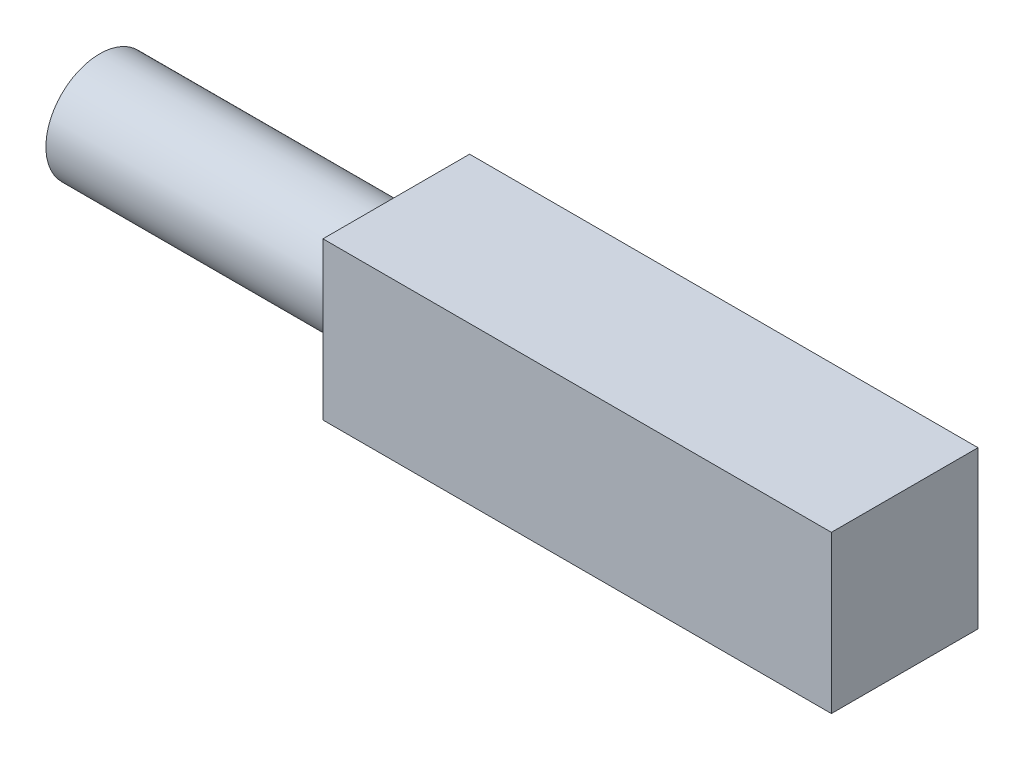
ISO-10303-21;
HEADER;
FILE_DESCRIPTION(('STEP AP214'),'2;1');
FILE_NAME('part.step','',(''),(''),'','','');
FILE_SCHEMA(('AUTOMOTIVE_DESIGN { 1 0 10303 214 1 1 1 1 }'));
ENDSEC;
DATA;
#1=APPLICATION_CONTEXT('core data for automotive mechanical design processes');
#2=APPLICATION_PROTOCOL_DEFINITION('international standard','automotive_design',2000,#1);
#3=PRODUCT_CONTEXT('',#1,'mechanical');
#4=PRODUCT('Part','Part','',(#3));
#5=PRODUCT_RELATED_PRODUCT_CATEGORY('part','',(#4));
#6=PRODUCT_DEFINITION_FORMATION('','',#4);
#7=PRODUCT_DEFINITION_CONTEXT('part definition',#1,'design');
#8=PRODUCT_DEFINITION('design','',#6,#7);
#9=PRODUCT_DEFINITION_SHAPE('','',#8);
#10=(LENGTH_UNIT() NAMED_UNIT(*) SI_UNIT(.MILLI.,.METRE.));
#11=(NAMED_UNIT(*) PLANE_ANGLE_UNIT() SI_UNIT($,.RADIAN.));
#12=(NAMED_UNIT(*) SI_UNIT($,.STERADIAN.) SOLID_ANGLE_UNIT());
#13=UNCERTAINTY_MEASURE_WITH_UNIT(LENGTH_MEASURE(1.E-05),#10,'distance_accuracy_value','');
#14=(GEOMETRIC_REPRESENTATION_CONTEXT(3) GLOBAL_UNCERTAINTY_ASSIGNED_CONTEXT((#13)) GLOBAL_UNIT_ASSIGNED_CONTEXT((#10,
#11,#12)) REPRESENTATION_CONTEXT('',''));
#15=CARTESIAN_POINT('',(0.,0.,0.));
#16=DIRECTION('',(0.,0.,1.));
#17=DIRECTION('',(1.,0.,0.));
#18=AXIS2_PLACEMENT_3D('',#15,#16,#17);
#19=CARTESIAN_POINT('',(70.,0.,0.));
#20=DIRECTION('',(-1.,0.,0.));
#21=DIRECTION('',(0.,0.,1.));
#22=AXIS2_PLACEMENT_3D('',#19,#20,#21);
#23=CYLINDRICAL_SURFACE('',#22,12.7);
#24=CARTESIAN_POINT('',(70.,0.,0.));
#25=DIRECTION('',(1.,0.,0.));
#26=DIRECTION('',(0.,0.,-1.));
#27=AXIS2_PLACEMENT_3D('',#24,#25,#26);
#28=CIRCLE('',#27,12.7);
#29=CARTESIAN_POINT('',(70.,0.,-12.7));
#30=VERTEX_POINT('',#29);
#31=EDGE_CURVE('E11',#30,#30,#28,.T.);
#32=ORIENTED_EDGE('',*,*,#31,.F.);
#33=EDGE_LOOP('',(#32));
#34=FACE_BOUND('',#33,.T.);
#35=CARTESIAN_POINT('',(0.,0.,0.));
#36=DIRECTION('',(1.,0.,0.));
#37=DIRECTION('',(0.,0.,-1.));
#38=AXIS2_PLACEMENT_3D('',#35,#36,#37);
#39=CIRCLE('',#38,12.7);
#40=CARTESIAN_POINT('',(0.,0.,-12.7));
#41=VERTEX_POINT('',#40);
#42=EDGE_CURVE('E52',#41,#41,#39,.T.);
#43=ORIENTED_EDGE('',*,*,#42,.T.);
#44=EDGE_LOOP('',(#43));
#45=FACE_BOUND('',#44,.T.);
#46=ADVANCED_FACE('F49',(#34,#45),#23,.T.);
#47=CARTESIAN_POINT('',(0.,0.,0.));
#48=DIRECTION('',(1.,0.,0.));
#49=DIRECTION('',(0.,0.,-1.));
#50=AXIS2_PLACEMENT_3D('',#47,#48,#49);
#51=PLANE('',#50);
#52=ORIENTED_EDGE('',*,*,#42,.F.);
#53=EDGE_LOOP('',(#52));
#54=FACE_BOUND('',#53,.T.);
#55=ADVANCED_FACE('F144',(#54),#51,.F.);
#56=CARTESIAN_POINT('',(190.,18.5250841118026,-17.3038774496838));
#57=DIRECTION('',(0.,-1.,0.));
#58=DIRECTION('',(0.,0.,-1.));
#59=AXIS2_PLACEMENT_3D('',#56,#57,#58);
#60=PLANE('',#59);
#61=DIRECTION('',(0.,0.,1.));
#62=VECTOR('',#61,1.);
#63=CARTESIAN_POINT('',(70.,18.5250841118026,-17.3038774496838));
#64=LINE('',#63,#62);
#65=CARTESIAN_POINT('',(70.,18.5250841118026,-17.3038774496838));
#66=VERTEX_POINT('',#65);
#67=CARTESIAN_POINT('',(70.,18.5250841118026,17.3038774496838));
#68=VERTEX_POINT('',#67);
#69=EDGE_CURVE('E122',#66,#68,#64,.T.);
#70=ORIENTED_EDGE('',*,*,#69,.T.);
#71=DIRECTION('',(-1.,0.,0.));
#72=VECTOR('',#71,1.);
#73=CARTESIAN_POINT('',(190.,18.5250841118026,17.3038774496838));
#74=LINE('',#73,#72);
#75=CARTESIAN_POINT('',(190.,18.5250841118026,17.3038774496838));
#76=VERTEX_POINT('',#75);
#77=EDGE_CURVE('E110',#76,#68,#74,.T.);
#78=ORIENTED_EDGE('',*,*,#77,.F.);
#79=DIRECTION('',(0.,0.,1.));
#80=VECTOR('',#79,1.);
#81=CARTESIAN_POINT('',(190.,18.5250841118026,-17.3038774496838));
#82=LINE('',#81,#80);
#83=CARTESIAN_POINT('',(190.,18.5250841118026,-17.3038774496838));
#84=VERTEX_POINT('',#83);
#85=EDGE_CURVE('E102',#84,#76,#82,.T.);
#86=ORIENTED_EDGE('',*,*,#85,.F.);
#87=DIRECTION('',(-1.,0.,0.));
#88=VECTOR('',#87,1.);
#89=CARTESIAN_POINT('',(190.,18.5250841118026,-17.3038774496838));
#90=LINE('',#89,#88);
#91=EDGE_CURVE('E118',#84,#66,#90,.T.);
#92=ORIENTED_EDGE('',*,*,#91,.T.);
#93=EDGE_LOOP('',(#70,#78,#86,#92));
#94=FACE_BOUND('',#93,.T.);
#95=ADVANCED_FACE('F146',(#94),#60,.F.);
#96=CARTESIAN_POINT('',(190.,-18.5250841118026,17.3038774496838));
#97=DIRECTION('',(0.,0.,-1.));
#98=DIRECTION('',(-1.,0.,0.));
#99=AXIS2_PLACEMENT_3D('',#96,#97,#98);
#100=PLANE('',#99);
#101=DIRECTION('',(0.,-1.,0.));
#102=VECTOR('',#101,1.);
#103=CARTESIAN_POINT('',(70.,-18.5250841118026,17.3038774496838));
#104=LINE('',#103,#102);
#105=CARTESIAN_POINT('',(70.,-18.5250841118026,17.3038774496838));
#106=VERTEX_POINT('',#105);
#107=EDGE_CURVE('E108',#68,#106,#104,.T.);
#108=ORIENTED_EDGE('',*,*,#107,.T.);
#109=DIRECTION('',(-1.,0.,0.));
#110=VECTOR('',#109,1.);
#111=CARTESIAN_POINT('',(190.,-18.5250841118026,17.3038774496838));
#112=LINE('',#111,#110);
#113=CARTESIAN_POINT('',(190.,-18.5250841118026,17.3038774496838));
#114=VERTEX_POINT('',#113);
#115=EDGE_CURVE('E106',#114,#106,#112,.T.);
#116=ORIENTED_EDGE('',*,*,#115,.F.);
#117=DIRECTION('',(0.,-1.,0.));
#118=VECTOR('',#117,1.);
#119=CARTESIAN_POINT('',(190.,-18.5250841118026,17.3038774496838));
#120=LINE('',#119,#118);
#121=EDGE_CURVE('E97',#76,#114,#120,.T.);
#122=ORIENTED_EDGE('',*,*,#121,.F.);
#123=ORIENTED_EDGE('',*,*,#77,.T.);
#124=EDGE_LOOP('',(#108,#116,#122,#123));
#125=FACE_BOUND('',#124,.T.);
#126=ADVANCED_FACE('F107',(#125),#100,.F.);
#127=CARTESIAN_POINT('',(190.,-18.5250841118026,-17.3038774496838));
#128=DIRECTION('',(0.,1.,0.));
#129=DIRECTION('',(0.,0.,1.));
#130=AXIS2_PLACEMENT_3D('',#127,#128,#129);
#131=PLANE('',#130);
#132=DIRECTION('',(0.,0.,-1.));
#133=VECTOR('',#132,1.);
#134=CARTESIAN_POINT('',(70.,-18.5250841118026,-17.3038774496838));
#135=LINE('',#134,#133);
#136=CARTESIAN_POINT('',(70.,-18.5250841118026,-17.3038774496838));
#137=VERTEX_POINT('',#136);
#138=EDGE_CURVE('E83',#106,#137,#135,.T.);
#139=ORIENTED_EDGE('',*,*,#138,.T.);
#140=DIRECTION('',(-1.,0.,0.));
#141=VECTOR('',#140,1.);
#142=CARTESIAN_POINT('',(190.,-18.5250841118026,-17.3038774496838));
#143=LINE('',#142,#141);
#144=CARTESIAN_POINT('',(190.,-18.5250841118026,-17.3038774496838));
#145=VERTEX_POINT('',#144);
#146=EDGE_CURVE('E111',#145,#137,#143,.T.);
#147=ORIENTED_EDGE('',*,*,#146,.F.);
#148=DIRECTION('',(0.,0.,-1.));
#149=VECTOR('',#148,1.);
#150=CARTESIAN_POINT('',(190.,-18.5250841118026,-17.3038774496838));
#151=LINE('',#150,#149);
#152=EDGE_CURVE('E100',#114,#145,#151,.T.);
#153=ORIENTED_EDGE('',*,*,#152,.F.);
#154=ORIENTED_EDGE('',*,*,#115,.T.);
#155=EDGE_LOOP('',(#139,#147,#153,#154));
#156=FACE_BOUND('',#155,.T.);
#157=ADVANCED_FACE('F113',(#156),#131,.F.);
#158=CARTESIAN_POINT('',(190.,-18.5250841118026,-17.3038774496838));
#159=DIRECTION('',(0.,0.,1.));
#160=DIRECTION('',(1.,0.,0.));
#161=AXIS2_PLACEMENT_3D('',#158,#159,#160);
#162=PLANE('',#161);
#163=DIRECTION('',(0.,1.,0.));
#164=VECTOR('',#163,1.);
#165=CARTESIAN_POINT('',(70.,-18.5250841118026,-17.3038774496838));
#166=LINE('',#165,#164);
#167=EDGE_CURVE('E89',#137,#66,#166,.T.);
#168=ORIENTED_EDGE('',*,*,#167,.T.);
#169=ORIENTED_EDGE('',*,*,#91,.F.);
#170=DIRECTION('',(0.,1.,0.));
#171=VECTOR('',#170,1.);
#172=CARTESIAN_POINT('',(190.,-18.5250841118026,-17.3038774496838));
#173=LINE('',#172,#171);
#174=EDGE_CURVE('E66',#145,#84,#173,.T.);
#175=ORIENTED_EDGE('',*,*,#174,.F.);
#176=ORIENTED_EDGE('',*,*,#146,.T.);
#177=EDGE_LOOP('',(#168,#169,#175,#176));
#178=FACE_BOUND('',#177,.T.);
#179=ADVANCED_FACE('F158',(#178),#162,.F.);
#180=CARTESIAN_POINT('',(190.,0.,0.));
#181=DIRECTION('',(-1.,0.,0.));
#182=DIRECTION('',(0.,0.,1.));
#183=AXIS2_PLACEMENT_3D('',#180,#181,#182);
#184=PLANE('',#183);
#185=ORIENTED_EDGE('',*,*,#85,.T.);
#186=ORIENTED_EDGE('',*,*,#121,.T.);
#187=ORIENTED_EDGE('',*,*,#152,.T.);
#188=ORIENTED_EDGE('',*,*,#174,.T.);
#189=EDGE_LOOP('',(#185,#186,#187,#188));
#190=FACE_BOUND('',#189,.T.);
#191=ADVANCED_FACE('F98',(#190),#184,.F.);
#192=CARTESIAN_POINT('',(70.,0.,0.));
#193=DIRECTION('',(-1.,0.,0.));
#194=DIRECTION('',(0.,0.,1.));
#195=AXIS2_PLACEMENT_3D('',#192,#193,#194);
#196=PLANE('',#195);
#197=ORIENTED_EDGE('',*,*,#31,.T.);
#198=EDGE_LOOP('',(#197));
#199=FACE_BOUND('',#198,.T.);
#200=ORIENTED_EDGE('',*,*,#69,.F.);
#201=ORIENTED_EDGE('',*,*,#167,.F.);
#202=ORIENTED_EDGE('',*,*,#138,.F.);
#203=ORIENTED_EDGE('',*,*,#107,.F.);
#204=EDGE_LOOP('',(#200,#201,#202,#203));
#205=FACE_BOUND('',#204,.T.);
#206=ADVANCED_FACE('F161',(#199,#205),#196,.T.);
#207=CLOSED_SHELL('',(#46,#55,#95,#126,#157,#179,#191,#206));
#208=MANIFOLD_SOLID_BREP('B2',#207);
#209=ADVANCED_BREP_SHAPE_REPRESENTATION('',(#18,#208),#14);
#210=SHAPE_DEFINITION_REPRESENTATION(#9,#209);
ENDSEC;
END-ISO-10303-21;
